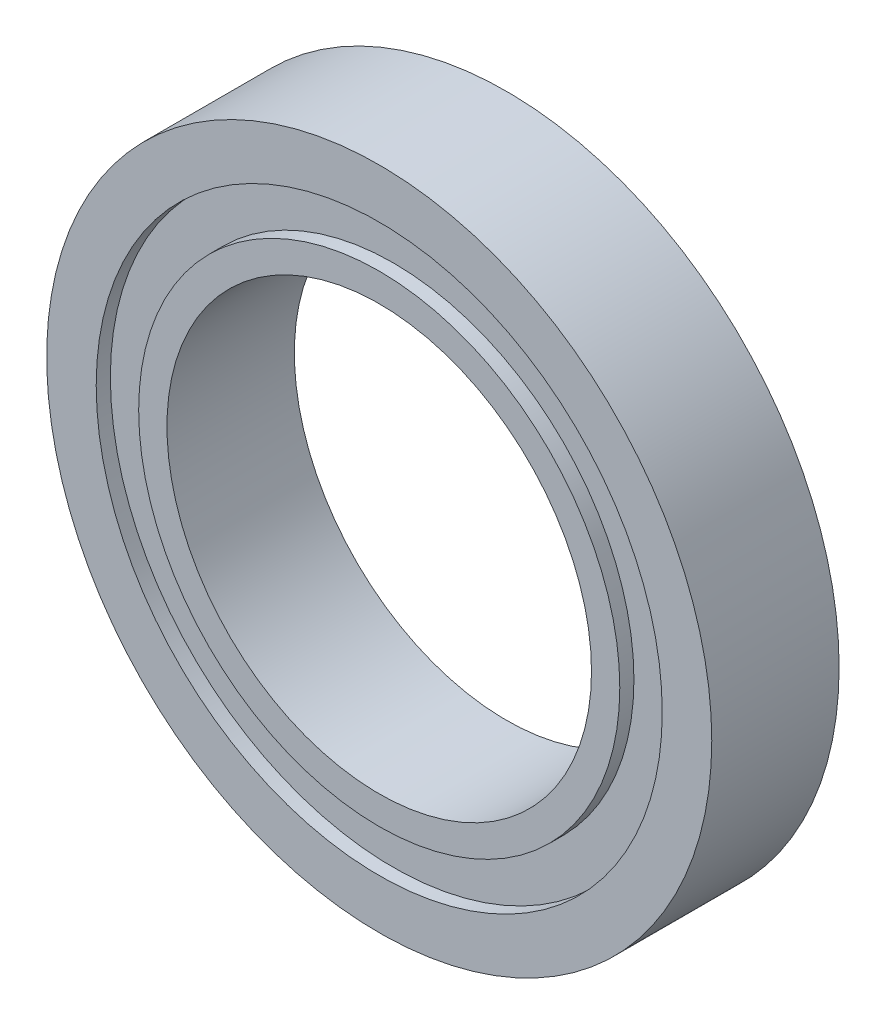
ISO-10303-21;
HEADER;
FILE_DESCRIPTION(('STEP AP214'),'2;1');
FILE_NAME('part.step','',(''),(''),'','','');
FILE_SCHEMA(('AUTOMOTIVE_DESIGN { 1 0 10303 214 1 1 1 1 }'));
ENDSEC;
DATA;
#1=APPLICATION_CONTEXT('core data for automotive mechanical design processes');
#2=APPLICATION_PROTOCOL_DEFINITION('international standard','automotive_design',2000,#1);
#3=PRODUCT_CONTEXT('',#1,'mechanical');
#4=PRODUCT('Part','Part','',(#3));
#5=PRODUCT_RELATED_PRODUCT_CATEGORY('part','',(#4));
#6=PRODUCT_DEFINITION_FORMATION('','',#4);
#7=PRODUCT_DEFINITION_CONTEXT('part definition',#1,'design');
#8=PRODUCT_DEFINITION('design','',#6,#7);
#9=PRODUCT_DEFINITION_SHAPE('','',#8);
#10=(LENGTH_UNIT() NAMED_UNIT(*) SI_UNIT(.MILLI.,.METRE.));
#11=(NAMED_UNIT(*) PLANE_ANGLE_UNIT() SI_UNIT($,.RADIAN.));
#12=(NAMED_UNIT(*) SI_UNIT($,.STERADIAN.) SOLID_ANGLE_UNIT());
#13=UNCERTAINTY_MEASURE_WITH_UNIT(LENGTH_MEASURE(1.E-05),#10,'distance_accuracy_value','');
#14=(GEOMETRIC_REPRESENTATION_CONTEXT(3) GLOBAL_UNCERTAINTY_ASSIGNED_CONTEXT((#13)) GLOBAL_UNIT_ASSIGNED_CONTEXT((#10,
#11,#12)) REPRESENTATION_CONTEXT('',''));
#15=CARTESIAN_POINT('',(0.,0.,0.));
#16=DIRECTION('',(0.,0.,1.));
#17=DIRECTION('',(1.,0.,0.));
#18=AXIS2_PLACEMENT_3D('',#15,#16,#17);
#19=CARTESIAN_POINT('',(0.,0.,9.));
#20=DIRECTION('',(0.,0.,1.));
#21=DIRECTION('',(1.,0.,0.));
#22=AXIS2_PLACEMENT_3D('',#19,#20,#21);
#23=PLANE('',#22);
#24=CARTESIAN_POINT('',(0.,0.,9.));
#25=DIRECTION('',(0.,0.,1.));
#26=DIRECTION('',(1.,0.,0.));
#27=AXIS2_PLACEMENT_3D('',#24,#25,#26);
#28=CIRCLE('',#27,15.);
#29=CARTESIAN_POINT('',(15.,0.,9.));
#30=VERTEX_POINT('',#29);
#31=EDGE_CURVE('E44',#30,#30,#28,.T.);
#32=ORIENTED_EDGE('',*,*,#31,.F.);
#33=EDGE_LOOP('',(#32));
#34=FACE_BOUND('',#33,.T.);
#35=CARTESIAN_POINT('',(0.,0.,9.));
#36=DIRECTION('',(0.,0.,1.));
#37=DIRECTION('',(1.,0.,0.));
#38=AXIS2_PLACEMENT_3D('',#35,#36,#37);
#39=CIRCLE('',#38,17.);
#40=CARTESIAN_POINT('',(17.,0.,9.));
#41=VERTEX_POINT('',#40);
#42=EDGE_CURVE('E58',#41,#41,#39,.T.);
#43=ORIENTED_EDGE('',*,*,#42,.T.);
#44=EDGE_LOOP('',(#43));
#45=FACE_BOUND('',#44,.T.);
#46=ADVANCED_FACE('F33',(#34,#45),#23,.T.);
#47=CARTESIAN_POINT('',(0.,0.,9.));
#48=DIRECTION('',(0.,0.,1.));
#49=DIRECTION('',(1.,0.,0.));
#50=AXIS2_PLACEMENT_3D('',#47,#48,#49);
#51=CIRCLE('',#50,20.);
#52=CARTESIAN_POINT('',(20.,0.,9.));
#53=VERTEX_POINT('',#52);
#54=EDGE_CURVE('E52',#53,#53,#51,.T.);
#55=ORIENTED_EDGE('',*,*,#54,.F.);
#56=EDGE_LOOP('',(#55));
#57=FACE_BOUND('',#56,.T.);
#58=CARTESIAN_POINT('',(0.,0.,9.));
#59=DIRECTION('',(0.,0.,1.));
#60=DIRECTION('',(1.,0.,0.));
#61=AXIS2_PLACEMENT_3D('',#58,#59,#60);
#62=CIRCLE('',#61,23.5);
#63=CARTESIAN_POINT('',(23.5,0.,9.));
#64=VERTEX_POINT('',#63);
#65=EDGE_CURVE('E10',#64,#64,#62,.T.);
#66=ORIENTED_EDGE('',*,*,#65,.T.);
#67=EDGE_LOOP('',(#66));
#68=FACE_BOUND('',#67,.T.);
#69=ADVANCED_FACE('F80',(#57,#68),#23,.T.);
#70=CARTESIAN_POINT('',(0.,0.,0.));
#71=DIRECTION('',(0.,0.,1.));
#72=DIRECTION('',(1.,0.,0.));
#73=AXIS2_PLACEMENT_3D('',#70,#71,#72);
#74=PLANE('',#73);
#75=CARTESIAN_POINT('',(0.,0.,0.));
#76=DIRECTION('',(0.,0.,1.));
#77=DIRECTION('',(1.,0.,0.));
#78=AXIS2_PLACEMENT_3D('',#75,#76,#77);
#79=CIRCLE('',#78,23.5);
#80=CARTESIAN_POINT('',(23.5,0.,0.));
#81=VERTEX_POINT('',#80);
#82=EDGE_CURVE('E37',#81,#81,#79,.T.);
#83=ORIENTED_EDGE('',*,*,#82,.F.);
#84=EDGE_LOOP('',(#83));
#85=FACE_BOUND('',#84,.T.);
#86=CARTESIAN_POINT('',(0.,0.,0.));
#87=DIRECTION('',(0.,0.,1.));
#88=DIRECTION('',(1.,0.,0.));
#89=AXIS2_PLACEMENT_3D('',#86,#87,#88);
#90=CIRCLE('',#89,15.);
#91=CARTESIAN_POINT('',(15.,0.,0.));
#92=VERTEX_POINT('',#91);
#93=EDGE_CURVE('E46',#92,#92,#90,.T.);
#94=ORIENTED_EDGE('',*,*,#93,.T.);
#95=EDGE_LOOP('',(#94));
#96=FACE_BOUND('',#95,.T.);
#97=ADVANCED_FACE('F82',(#85,#96),#74,.F.);
#98=CARTESIAN_POINT('',(0.,0.,9.));
#99=DIRECTION('',(0.,0.,-1.));
#100=DIRECTION('',(-1.,0.,0.));
#101=AXIS2_PLACEMENT_3D('',#98,#99,#100);
#102=CYLINDRICAL_SURFACE('',#101,23.5);
#103=ORIENTED_EDGE('',*,*,#65,.F.);
#104=EDGE_LOOP('',(#103));
#105=FACE_BOUND('',#104,.T.);
#106=ORIENTED_EDGE('',*,*,#82,.T.);
#107=EDGE_LOOP('',(#106));
#108=FACE_BOUND('',#107,.T.);
#109=ADVANCED_FACE('F35',(#105,#108),#102,.T.);
#110=CARTESIAN_POINT('',(0.,0.,9.));
#111=DIRECTION('',(0.,0.,-1.));
#112=DIRECTION('',(-1.,0.,0.));
#113=AXIS2_PLACEMENT_3D('',#110,#111,#112);
#114=CYLINDRICAL_SURFACE('',#113,15.);
#115=ORIENTED_EDGE('',*,*,#31,.T.);
#116=EDGE_LOOP('',(#115));
#117=FACE_BOUND('',#116,.T.);
#118=ORIENTED_EDGE('',*,*,#93,.F.);
#119=EDGE_LOOP('',(#118));
#120=FACE_BOUND('',#119,.T.);
#121=ADVANCED_FACE('F76',(#117,#120),#114,.F.);
#122=CARTESIAN_POINT('',(0.,0.,8.));
#123=DIRECTION('',(0.,0.,1.));
#124=DIRECTION('',(1.,0.,0.));
#125=AXIS2_PLACEMENT_3D('',#122,#123,#124);
#126=CYLINDRICAL_SURFACE('',#125,20.);
#127=CARTESIAN_POINT('',(0.,0.,8.));
#128=DIRECTION('',(0.,0.,1.));
#129=DIRECTION('',(1.,0.,0.));
#130=AXIS2_PLACEMENT_3D('',#127,#128,#129);
#131=CIRCLE('',#130,20.);
#132=CARTESIAN_POINT('',(20.,0.,8.));
#133=VERTEX_POINT('',#132);
#134=EDGE_CURVE('E49',#133,#133,#131,.T.);
#135=ORIENTED_EDGE('',*,*,#134,.F.);
#136=EDGE_LOOP('',(#135));
#137=FACE_BOUND('',#136,.T.);
#138=ORIENTED_EDGE('',*,*,#54,.T.);
#139=EDGE_LOOP('',(#138));
#140=FACE_BOUND('',#139,.T.);
#141=ADVANCED_FACE('F70',(#137,#140),#126,.F.);
#142=CARTESIAN_POINT('',(0.,0.,8.));
#143=DIRECTION('',(0.,0.,1.));
#144=DIRECTION('',(1.,0.,0.));
#145=AXIS2_PLACEMENT_3D('',#142,#143,#144);
#146=PLANE('',#145);
#147=CARTESIAN_POINT('',(0.,0.,8.));
#148=DIRECTION('',(0.,0.,1.));
#149=DIRECTION('',(1.,0.,0.));
#150=AXIS2_PLACEMENT_3D('',#147,#148,#149);
#151=CIRCLE('',#150,17.);
#152=CARTESIAN_POINT('',(17.,0.,8.));
#153=VERTEX_POINT('',#152);
#154=EDGE_CURVE('E55',#153,#153,#151,.T.);
#155=ORIENTED_EDGE('',*,*,#154,.F.);
#156=EDGE_LOOP('',(#155));
#157=FACE_BOUND('',#156,.T.);
#158=ORIENTED_EDGE('',*,*,#134,.T.);
#159=EDGE_LOOP('',(#158));
#160=FACE_BOUND('',#159,.T.);
#161=ADVANCED_FACE('F67',(#157,#160),#146,.T.);
#162=CARTESIAN_POINT('',(0.,0.,8.));
#163=DIRECTION('',(0.,0.,1.));
#164=DIRECTION('',(1.,0.,0.));
#165=AXIS2_PLACEMENT_3D('',#162,#163,#164);
#166=CYLINDRICAL_SURFACE('',#165,17.);
#167=ORIENTED_EDGE('',*,*,#154,.T.);
#168=EDGE_LOOP('',(#167));
#169=FACE_BOUND('',#168,.T.);
#170=ORIENTED_EDGE('',*,*,#42,.F.);
#171=EDGE_LOOP('',(#170));
#172=FACE_BOUND('',#171,.T.);
#173=ADVANCED_FACE('F64',(#169,#172),#166,.T.);
#174=CLOSED_SHELL('',(#46,#69,#97,#109,#121,#141,#161,#173));
#175=MANIFOLD_SOLID_BREP('B2',#174);
#176=ADVANCED_BREP_SHAPE_REPRESENTATION('',(#18,#175),#14);
#177=SHAPE_DEFINITION_REPRESENTATION(#9,#176);
ENDSEC;
END-ISO-10303-21;
